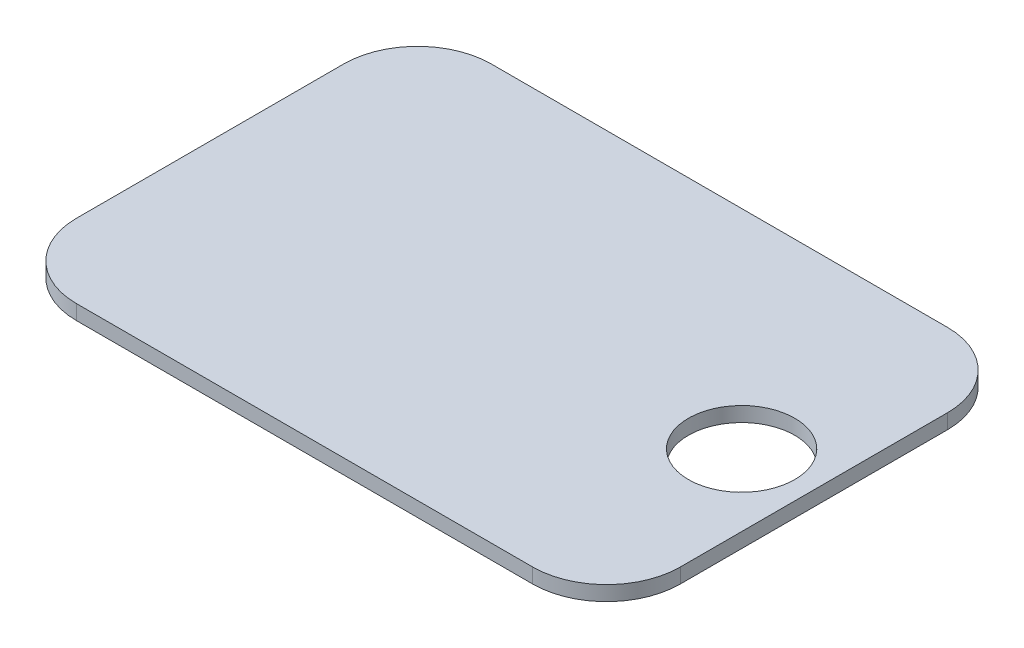
ISO-10303-21;
HEADER;
FILE_DESCRIPTION(('STEP AP214'),'2;1');
FILE_NAME('part.step','',(''),(''),'','','');
FILE_SCHEMA(('AUTOMOTIVE_DESIGN { 1 0 10303 214 1 1 1 1 }'));
ENDSEC;
DATA;
#1=APPLICATION_CONTEXT('core data for automotive mechanical design processes');
#2=APPLICATION_PROTOCOL_DEFINITION('international standard','automotive_design',2000,#1);
#3=PRODUCT_CONTEXT('',#1,'mechanical');
#4=PRODUCT('Part','Part','',(#3));
#5=PRODUCT_RELATED_PRODUCT_CATEGORY('part','',(#4));
#6=PRODUCT_DEFINITION_FORMATION('','',#4);
#7=PRODUCT_DEFINITION_CONTEXT('part definition',#1,'design');
#8=PRODUCT_DEFINITION('design','',#6,#7);
#9=PRODUCT_DEFINITION_SHAPE('','',#8);
#10=(LENGTH_UNIT() NAMED_UNIT(*) SI_UNIT(.MILLI.,.METRE.));
#11=(NAMED_UNIT(*) PLANE_ANGLE_UNIT() SI_UNIT($,.RADIAN.));
#12=(NAMED_UNIT(*) SI_UNIT($,.STERADIAN.) SOLID_ANGLE_UNIT());
#13=UNCERTAINTY_MEASURE_WITH_UNIT(LENGTH_MEASURE(1.E-05),#10,'distance_accuracy_value','');
#14=(GEOMETRIC_REPRESENTATION_CONTEXT(3) GLOBAL_UNCERTAINTY_ASSIGNED_CONTEXT((#13)) GLOBAL_UNIT_ASSIGNED_CONTEXT((#10,
#11,#12)) REPRESENTATION_CONTEXT('',''));
#15=CARTESIAN_POINT('',(0.,0.,0.));
#16=DIRECTION('',(0.,0.,1.));
#17=DIRECTION('',(1.,0.,0.));
#18=AXIS2_PLACEMENT_3D('',#15,#16,#17);
#19=CARTESIAN_POINT('',(25.759670781893,1.,13.0395061728395));
#20=DIRECTION('',(0.,1.,0.));
#21=DIRECTION('',(0.,0.,1.));
#22=AXIS2_PLACEMENT_3D('',#19,#20,#21);
#23=PLANE('',#22);
#24=CARTESIAN_POINT('',(25.759670781893,1.,13.0395061728395));
#25=DIRECTION('',(0.,1.,0.));
#26=DIRECTION('',(0.,0.,1.));
#27=AXIS2_PLACEMENT_3D('',#24,#25,#26);
#28=CIRCLE('',#27,5.);
#29=CARTESIAN_POINT('',(25.759670781893,1.,18.0395061728395));
#30=VERTEX_POINT('',#29);
#31=CARTESIAN_POINT('',(30.759670781893,1.,13.0395061728395));
#32=VERTEX_POINT('',#31);
#33=EDGE_CURVE('E168',#30,#32,#28,.T.);
#34=ORIENTED_EDGE('',*,*,#33,.T.);
#35=DIRECTION('',(0.,0.,-1.));
#36=VECTOR('',#35,1.);
#37=CARTESIAN_POINT('',(30.759670781893,1.,-5.06049382716046));
#38=LINE('',#37,#36);
#39=CARTESIAN_POINT('',(30.759670781893,1.,-5.06049382716046));
#40=VERTEX_POINT('',#39);
#41=EDGE_CURVE('E104',#32,#40,#38,.T.);
#42=ORIENTED_EDGE('',*,*,#41,.T.);
#43=CARTESIAN_POINT('',(25.759670781893,1.,-5.0604938271605));
#44=DIRECTION('',(0.,1.,0.));
#45=DIRECTION('',(0.,0.,-1.));
#46=AXIS2_PLACEMENT_3D('',#43,#44,#45);
#47=CIRCLE('',#46,5.);
#48=CARTESIAN_POINT('',(25.759670781893,1.,-10.0604938271605));
#49=VERTEX_POINT('',#48);
#50=EDGE_CURVE('E189',#40,#49,#47,.T.);
#51=ORIENTED_EDGE('',*,*,#50,.T.);
#52=DIRECTION('',(-1.,0.,0.));
#53=VECTOR('',#52,1.);
#54=CARTESIAN_POINT('',(-5.14032921810697,1.,-10.0604938271605));
#55=LINE('',#54,#53);
#56=CARTESIAN_POINT('',(-5.14032921810697,1.,-10.0604938271605));
#57=VERTEX_POINT('',#56);
#58=EDGE_CURVE('E203',#49,#57,#55,.T.);
#59=ORIENTED_EDGE('',*,*,#58,.T.);
#60=CARTESIAN_POINT('',(-5.14032921810701,1.,-5.0604938271605));
#61=DIRECTION('',(0.,1.,0.));
#62=DIRECTION('',(0.,0.,1.));
#63=AXIS2_PLACEMENT_3D('',#60,#61,#62);
#64=CIRCLE('',#63,5.);
#65=CARTESIAN_POINT('',(-10.140329218107,1.,-5.06049382716046));
#66=VERTEX_POINT('',#65);
#67=EDGE_CURVE('E123',#57,#66,#64,.T.);
#68=ORIENTED_EDGE('',*,*,#67,.T.);
#69=DIRECTION('',(0.,0.,1.));
#70=VECTOR('',#69,1.);
#71=CARTESIAN_POINT('',(-10.140329218107,1.,-5.06049382716046));
#72=LINE('',#71,#70);
#73=CARTESIAN_POINT('',(-10.140329218107,1.,13.0395061728395));
#74=VERTEX_POINT('',#73);
#75=EDGE_CURVE('E117',#66,#74,#72,.T.);
#76=ORIENTED_EDGE('',*,*,#75,.T.);
#77=CARTESIAN_POINT('',(-5.14032921810701,1.,13.0395061728395));
#78=DIRECTION('',(0.,1.,0.));
#79=DIRECTION('',(0.,0.,1.));
#80=AXIS2_PLACEMENT_3D('',#77,#78,#79);
#81=CIRCLE('',#80,5.);
#82=CARTESIAN_POINT('',(-5.14032921810697,1.,18.0395061728395));
#83=VERTEX_POINT('',#82);
#84=EDGE_CURVE('E121',#74,#83,#81,.T.);
#85=ORIENTED_EDGE('',*,*,#84,.T.);
#86=DIRECTION('',(1.,0.,0.));
#87=VECTOR('',#86,1.);
#88=CARTESIAN_POINT('',(-5.14032921810697,1.,18.0395061728395));
#89=LINE('',#88,#87);
#90=EDGE_CURVE('E61',#83,#30,#89,.T.);
#91=ORIENTED_EDGE('',*,*,#90,.T.);
#92=EDGE_LOOP('',(#34,#42,#51,#59,#68,#76,#85,#91));
#93=FACE_BOUND('',#92,.T.);
#94=CARTESIAN_POINT('',(25.909670781893,1.,4.0395061728395));
#95=DIRECTION('',(0.,1.,0.));
#96=DIRECTION('',(0.,0.,1.));
#97=AXIS2_PLACEMENT_3D('',#94,#95,#96);
#98=CIRCLE('',#97,3.6);
#99=CARTESIAN_POINT('',(25.909670781893,1.,7.6395061728395));
#100=VERTEX_POINT('',#99);
#101=EDGE_CURVE('E150',#100,#100,#98,.T.);
#102=ORIENTED_EDGE('',*,*,#101,.F.);
#103=EDGE_LOOP('',(#102));
#104=FACE_BOUND('',#103,.T.);
#105=ADVANCED_FACE('F43',(#93,#104),#23,.T.);
#106=CARTESIAN_POINT('',(25.759670781893,0.,13.0395061728395));
#107=DIRECTION('',(0.,1.,0.));
#108=DIRECTION('',(0.,0.,1.));
#109=AXIS2_PLACEMENT_3D('',#106,#107,#108);
#110=PLANE('',#109);
#111=CARTESIAN_POINT('',(25.759670781893,0.,13.0395061728395));
#112=DIRECTION('',(0.,1.,0.));
#113=DIRECTION('',(0.,0.,1.));
#114=AXIS2_PLACEMENT_3D('',#111,#112,#113);
#115=CIRCLE('',#114,5.);
#116=CARTESIAN_POINT('',(25.759670781893,0.,18.0395061728395));
#117=VERTEX_POINT('',#116);
#118=CARTESIAN_POINT('',(30.759670781893,0.,13.0395061728395));
#119=VERTEX_POINT('',#118);
#120=EDGE_CURVE('E145',#117,#119,#115,.T.);
#121=ORIENTED_EDGE('',*,*,#120,.F.);
#122=DIRECTION('',(1.,0.,0.));
#123=VECTOR('',#122,1.);
#124=CARTESIAN_POINT('',(-5.14032921810697,0.,18.0395061728395));
#125=LINE('',#124,#123);
#126=CARTESIAN_POINT('',(-5.14032921810697,0.,18.0395061728395));
#127=VERTEX_POINT('',#126);
#128=EDGE_CURVE('E96',#127,#117,#125,.T.);
#129=ORIENTED_EDGE('',*,*,#128,.F.);
#130=CARTESIAN_POINT('',(-5.14032921810701,0.,13.0395061728395));
#131=DIRECTION('',(0.,1.,0.));
#132=DIRECTION('',(0.,0.,1.));
#133=AXIS2_PLACEMENT_3D('',#130,#131,#132);
#134=CIRCLE('',#133,5.);
#135=CARTESIAN_POINT('',(-10.140329218107,0.,13.0395061728395));
#136=VERTEX_POINT('',#135);
#137=EDGE_CURVE('E90',#136,#127,#134,.T.);
#138=ORIENTED_EDGE('',*,*,#137,.F.);
#139=DIRECTION('',(0.,0.,1.));
#140=VECTOR('',#139,1.);
#141=CARTESIAN_POINT('',(-10.140329218107,0.,-5.06049382716046));
#142=LINE('',#141,#140);
#143=CARTESIAN_POINT('',(-10.140329218107,0.,-5.06049382716046));
#144=VERTEX_POINT('',#143);
#145=EDGE_CURVE('E132',#144,#136,#142,.T.);
#146=ORIENTED_EDGE('',*,*,#145,.F.);
#147=CARTESIAN_POINT('',(-5.14032921810701,0.,-5.0604938271605));
#148=DIRECTION('',(0.,1.,0.));
#149=DIRECTION('',(0.,0.,1.));
#150=AXIS2_PLACEMENT_3D('',#147,#148,#149);
#151=CIRCLE('',#150,5.);
#152=CARTESIAN_POINT('',(-5.14032921810697,0.,-10.0604938271605));
#153=VERTEX_POINT('',#152);
#154=EDGE_CURVE('E159',#153,#144,#151,.T.);
#155=ORIENTED_EDGE('',*,*,#154,.F.);
#156=DIRECTION('',(-1.,0.,0.));
#157=VECTOR('',#156,1.);
#158=CARTESIAN_POINT('',(-5.14032921810697,0.,-10.0604938271605));
#159=LINE('',#158,#157);
#160=CARTESIAN_POINT('',(25.759670781893,0.,-10.0604938271605));
#161=VERTEX_POINT('',#160);
#162=EDGE_CURVE('E156',#161,#153,#159,.T.);
#163=ORIENTED_EDGE('',*,*,#162,.F.);
#164=CARTESIAN_POINT('',(25.759670781893,0.,-5.0604938271605));
#165=DIRECTION('',(0.,1.,0.));
#166=DIRECTION('',(0.,0.,-1.));
#167=AXIS2_PLACEMENT_3D('',#164,#165,#166);
#168=CIRCLE('',#167,5.);
#169=CARTESIAN_POINT('',(30.759670781893,0.,-5.06049382716046));
#170=VERTEX_POINT('',#169);
#171=EDGE_CURVE('E153',#170,#161,#168,.T.);
#172=ORIENTED_EDGE('',*,*,#171,.F.);
#173=DIRECTION('',(0.,0.,-1.));
#174=VECTOR('',#173,1.);
#175=CARTESIAN_POINT('',(30.759670781893,0.,-5.06049382716046));
#176=LINE('',#175,#174);
#177=EDGE_CURVE('E149',#119,#170,#176,.T.);
#178=ORIENTED_EDGE('',*,*,#177,.F.);
#179=EDGE_LOOP('',(#121,#129,#138,#146,#155,#163,#172,#178));
#180=FACE_BOUND('',#179,.T.);
#181=CARTESIAN_POINT('',(25.909670781893,0.,4.0395061728395));
#182=DIRECTION('',(0.,1.,0.));
#183=DIRECTION('',(0.,0.,1.));
#184=AXIS2_PLACEMENT_3D('',#181,#182,#183);
#185=CIRCLE('',#184,3.6);
#186=CARTESIAN_POINT('',(25.909670781893,0.,7.6395061728395));
#187=VERTEX_POINT('',#186);
#188=EDGE_CURVE('E213',#187,#187,#185,.T.);
#189=ORIENTED_EDGE('',*,*,#188,.T.);
#190=EDGE_LOOP('',(#189));
#191=FACE_BOUND('',#190,.T.);
#192=ADVANCED_FACE('F193',(#180,#191),#110,.F.);
#193=CARTESIAN_POINT('',(25.759670781893,1.,13.0395061728395));
#194=DIRECTION('',(0.,-1.,0.));
#195=DIRECTION('',(0.,0.,-1.));
#196=AXIS2_PLACEMENT_3D('',#193,#194,#195);
#197=CYLINDRICAL_SURFACE('',#196,5.);
#198=ORIENTED_EDGE('',*,*,#120,.T.);
#199=DIRECTION('',(0.,-1.,0.));
#200=VECTOR('',#199,1.);
#201=CARTESIAN_POINT('',(30.759670781893,1.,13.0395061728395));
#202=LINE('',#201,#200);
#203=EDGE_CURVE('E11',#32,#119,#202,.T.);
#204=ORIENTED_EDGE('',*,*,#203,.F.);
#205=ORIENTED_EDGE('',*,*,#33,.F.);
#206=DIRECTION('',(0.,-1.,0.));
#207=VECTOR('',#206,1.);
#208=CARTESIAN_POINT('',(25.759670781893,1.,18.0395061728395));
#209=LINE('',#208,#207);
#210=EDGE_CURVE('E141',#30,#117,#209,.T.);
#211=ORIENTED_EDGE('',*,*,#210,.T.);
#212=EDGE_LOOP('',(#198,#204,#205,#211));
#213=FACE_BOUND('',#212,.T.);
#214=ADVANCED_FACE('F45',(#213),#197,.T.);
#215=CARTESIAN_POINT('',(30.759670781893,1.,-5.06049382716046));
#216=DIRECTION('',(-1.,0.,0.));
#217=DIRECTION('',(0.,0.,1.));
#218=AXIS2_PLACEMENT_3D('',#215,#216,#217);
#219=PLANE('',#218);
#220=ORIENTED_EDGE('',*,*,#177,.T.);
#221=DIRECTION('',(0.,-1.,0.));
#222=VECTOR('',#221,1.);
#223=CARTESIAN_POINT('',(30.759670781893,1.,-5.06049382716046));
#224=LINE('',#223,#222);
#225=EDGE_CURVE('E53',#40,#170,#224,.T.);
#226=ORIENTED_EDGE('',*,*,#225,.F.);
#227=ORIENTED_EDGE('',*,*,#41,.F.);
#228=ORIENTED_EDGE('',*,*,#203,.T.);
#229=EDGE_LOOP('',(#220,#226,#227,#228));
#230=FACE_BOUND('',#229,.T.);
#231=ADVANCED_FACE('F243',(#230),#219,.F.);
#232=CARTESIAN_POINT('',(25.759670781893,1.,-5.0604938271605));
#233=DIRECTION('',(0.,-1.,0.));
#234=DIRECTION('',(0.,0.,-1.));
#235=AXIS2_PLACEMENT_3D('',#232,#233,#234);
#236=CYLINDRICAL_SURFACE('',#235,5.);
#237=ORIENTED_EDGE('',*,*,#171,.T.);
#238=DIRECTION('',(0.,-1.,0.));
#239=VECTOR('',#238,1.);
#240=CARTESIAN_POINT('',(25.759670781893,1.,-10.0604938271605));
#241=LINE('',#240,#239);
#242=EDGE_CURVE('E179',#49,#161,#241,.T.);
#243=ORIENTED_EDGE('',*,*,#242,.F.);
#244=ORIENTED_EDGE('',*,*,#50,.F.);
#245=ORIENTED_EDGE('',*,*,#225,.T.);
#246=EDGE_LOOP('',(#237,#243,#244,#245));
#247=FACE_BOUND('',#246,.T.);
#248=ADVANCED_FACE('F187',(#247),#236,.T.);
#249=CARTESIAN_POINT('',(-5.14032921810697,1.,-10.0604938271605));
#250=DIRECTION('',(0.,0.,1.));
#251=DIRECTION('',(1.,0.,0.));
#252=AXIS2_PLACEMENT_3D('',#249,#250,#251);
#253=PLANE('',#252);
#254=ORIENTED_EDGE('',*,*,#162,.T.);
#255=DIRECTION('',(0.,-1.,0.));
#256=VECTOR('',#255,1.);
#257=CARTESIAN_POINT('',(-5.14032921810697,1.,-10.0604938271605));
#258=LINE('',#257,#256);
#259=EDGE_CURVE('E175',#57,#153,#258,.T.);
#260=ORIENTED_EDGE('',*,*,#259,.F.);
#261=ORIENTED_EDGE('',*,*,#58,.F.);
#262=ORIENTED_EDGE('',*,*,#242,.T.);
#263=EDGE_LOOP('',(#254,#260,#261,#262));
#264=FACE_BOUND('',#263,.T.);
#265=ADVANCED_FACE('F198',(#264),#253,.F.);
#266=CARTESIAN_POINT('',(-5.14032921810701,1.,-5.0604938271605));
#267=DIRECTION('',(0.,-1.,0.));
#268=DIRECTION('',(0.,0.,-1.));
#269=AXIS2_PLACEMENT_3D('',#266,#267,#268);
#270=CYLINDRICAL_SURFACE('',#269,5.);
#271=ORIENTED_EDGE('',*,*,#154,.T.);
#272=DIRECTION('',(0.,-1.,0.));
#273=VECTOR('',#272,1.);
#274=CARTESIAN_POINT('',(-10.140329218107,1.,-5.06049382716046));
#275=LINE('',#274,#273);
#276=EDGE_CURVE('E134',#66,#144,#275,.T.);
#277=ORIENTED_EDGE('',*,*,#276,.F.);
#278=ORIENTED_EDGE('',*,*,#67,.F.);
#279=ORIENTED_EDGE('',*,*,#259,.T.);
#280=EDGE_LOOP('',(#271,#277,#278,#279));
#281=FACE_BOUND('',#280,.T.);
#282=ADVANCED_FACE('F201',(#281),#270,.T.);
#283=CARTESIAN_POINT('',(-10.140329218107,1.,-5.06049382716046));
#284=DIRECTION('',(1.,0.,0.));
#285=DIRECTION('',(0.,0.,-1.));
#286=AXIS2_PLACEMENT_3D('',#283,#284,#285);
#287=PLANE('',#286);
#288=ORIENTED_EDGE('',*,*,#145,.T.);
#289=DIRECTION('',(0.,-1.,0.));
#290=VECTOR('',#289,1.);
#291=CARTESIAN_POINT('',(-10.140329218107,1.,13.0395061728395));
#292=LINE('',#291,#290);
#293=EDGE_CURVE('E129',#74,#136,#292,.T.);
#294=ORIENTED_EDGE('',*,*,#293,.F.);
#295=ORIENTED_EDGE('',*,*,#75,.F.);
#296=ORIENTED_EDGE('',*,*,#276,.T.);
#297=EDGE_LOOP('',(#288,#294,#295,#296));
#298=FACE_BOUND('',#297,.T.);
#299=ADVANCED_FACE('F130',(#298),#287,.F.);
#300=CARTESIAN_POINT('',(-5.14032921810701,1.,13.0395061728395));
#301=DIRECTION('',(0.,-1.,0.));
#302=DIRECTION('',(0.,0.,-1.));
#303=AXIS2_PLACEMENT_3D('',#300,#301,#302);
#304=CYLINDRICAL_SURFACE('',#303,5.);
#305=ORIENTED_EDGE('',*,*,#137,.T.);
#306=DIRECTION('',(0.,-1.,0.));
#307=VECTOR('',#306,1.);
#308=CARTESIAN_POINT('',(-5.14032921810697,1.,18.0395061728395));
#309=LINE('',#308,#307);
#310=EDGE_CURVE('E135',#83,#127,#309,.T.);
#311=ORIENTED_EDGE('',*,*,#310,.F.);
#312=ORIENTED_EDGE('',*,*,#84,.F.);
#313=ORIENTED_EDGE('',*,*,#293,.T.);
#314=EDGE_LOOP('',(#305,#311,#312,#313));
#315=FACE_BOUND('',#314,.T.);
#316=ADVANCED_FACE('F137',(#315),#304,.T.);
#317=CARTESIAN_POINT('',(-5.14032921810697,1.,18.0395061728395));
#318=DIRECTION('',(0.,0.,-1.));
#319=DIRECTION('',(-1.,0.,0.));
#320=AXIS2_PLACEMENT_3D('',#317,#318,#319);
#321=PLANE('',#320);
#322=ORIENTED_EDGE('',*,*,#128,.T.);
#323=ORIENTED_EDGE('',*,*,#210,.F.);
#324=ORIENTED_EDGE('',*,*,#90,.F.);
#325=ORIENTED_EDGE('',*,*,#310,.T.);
#326=EDGE_LOOP('',(#322,#323,#324,#325));
#327=FACE_BOUND('',#326,.T.);
#328=ADVANCED_FACE('F231',(#327),#321,.F.);
#329=CARTESIAN_POINT('',(25.909670781893,1.,4.0395061728395));
#330=DIRECTION('',(0.,-1.,0.));
#331=DIRECTION('',(0.,0.,-1.));
#332=AXIS2_PLACEMENT_3D('',#329,#330,#331);
#333=CYLINDRICAL_SURFACE('',#332,3.6);
#334=ORIENTED_EDGE('',*,*,#101,.T.);
#335=EDGE_LOOP('',(#334));
#336=FACE_BOUND('',#335,.T.);
#337=ORIENTED_EDGE('',*,*,#188,.F.);
#338=EDGE_LOOP('',(#337));
#339=FACE_BOUND('',#338,.T.);
#340=ADVANCED_FACE('F221',(#336,#339),#333,.F.);
#341=CLOSED_SHELL('',(#105,#192,#214,#231,#248,#265,#282,#299,#316,#328,#340));
#342=MANIFOLD_SOLID_BREP('B2',#341);
#343=ADVANCED_BREP_SHAPE_REPRESENTATION('',(#18,#342),#14);
#344=SHAPE_DEFINITION_REPRESENTATION(#9,#343);
ENDSEC;
END-ISO-10303-21;
